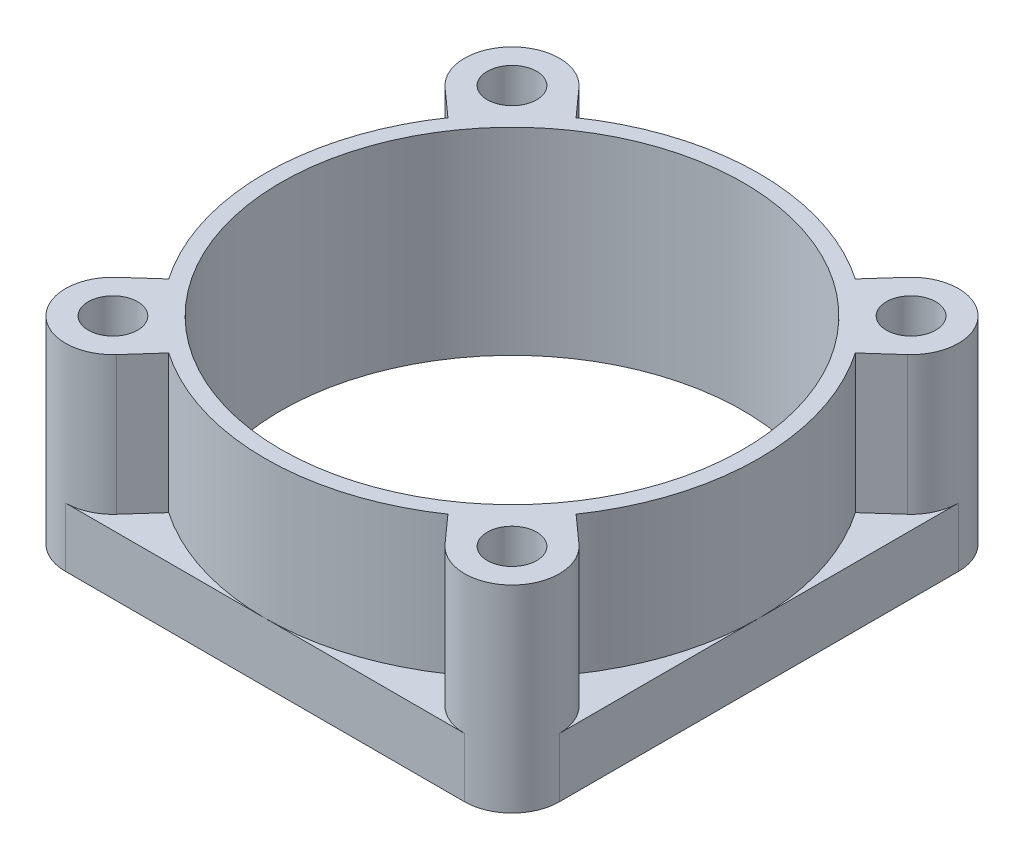
ISO-10303-21;
HEADER;
FILE_DESCRIPTION(('STEP AP214'),'2;1');
FILE_NAME('part.step','',(''),(''),'','','');
FILE_SCHEMA(('AUTOMOTIVE_DESIGN { 1 0 10303 214 1 1 1 1 }'));
ENDSEC;
DATA;
#1=APPLICATION_CONTEXT('core data for automotive mechanical design processes');
#2=APPLICATION_PROTOCOL_DEFINITION('international standard','automotive_design',2000,#1);
#3=PRODUCT_CONTEXT('',#1,'mechanical');
#4=PRODUCT('Part','Part','',(#3));
#5=PRODUCT_RELATED_PRODUCT_CATEGORY('part','',(#4));
#6=PRODUCT_DEFINITION_FORMATION('','',#4);
#7=PRODUCT_DEFINITION_CONTEXT('part definition',#1,'design');
#8=PRODUCT_DEFINITION('design','',#6,#7);
#9=PRODUCT_DEFINITION_SHAPE('','',#8);
#10=(LENGTH_UNIT() NAMED_UNIT(*) SI_UNIT(.MILLI.,.METRE.));
#11=(NAMED_UNIT(*) PLANE_ANGLE_UNIT() SI_UNIT($,.RADIAN.));
#12=(NAMED_UNIT(*) SI_UNIT($,.STERADIAN.) SOLID_ANGLE_UNIT());
#13=UNCERTAINTY_MEASURE_WITH_UNIT(LENGTH_MEASURE(1.E-05),#10,'distance_accuracy_value','');
#14=(GEOMETRIC_REPRESENTATION_CONTEXT(3) GLOBAL_UNCERTAINTY_ASSIGNED_CONTEXT((#13)) GLOBAL_UNIT_ASSIGNED_CONTEXT((#10,
#11,#12)) REPRESENTATION_CONTEXT('',''));
#15=CARTESIAN_POINT('',(0.,0.,0.));
#16=DIRECTION('',(0.,0.,1.));
#17=DIRECTION('',(1.,0.,0.));
#18=AXIS2_PLACEMENT_3D('',#15,#16,#17);
#19=CARTESIAN_POINT('',(-10.1,3.,10.1));
#20=DIRECTION('',(0.,-1.,0.));
#21=DIRECTION('',(0.,0.,-1.));
#22=AXIS2_PLACEMENT_3D('',#19,#20,#21);
#23=PLANE('',#22);
#24=CARTESIAN_POINT('',(0.,3.,0.));
#25=DIRECTION('',(0.,1.,0.));
#26=DIRECTION('',(0.,0.,1.));
#27=AXIS2_PLACEMENT_3D('',#24,#25,#26);
#28=CIRCLE('',#27,12.5);
#29=CARTESIAN_POINT('',(-10.3104171563499,3.,-7.06719874222066));
#30=VERTEX_POINT('',#29);
#31=CARTESIAN_POINT('',(-12.5,3.,0.));
#32=VERTEX_POINT('',#31);
#33=EDGE_CURVE('E311',#30,#32,#28,.T.);
#34=ORIENTED_EDGE('',*,*,#33,.F.);
#35=DIRECTION('',(0.745071934024043,0.,0.666984117599267));
#36=VECTOR('',#35,1.);
#37=CARTESIAN_POINT('',(-1.07472021557158,3.,1.20054413354374));
#38=LINE('',#37,#36);
#39=CARTESIAN_POINT('',(-11.7007618822382,3.,-8.3118273583423));
#40=VERTEX_POINT('',#39);
#41=EDGE_CURVE('E308',#40,#30,#38,.T.);
#42=ORIENTED_EDGE('',*,*,#41,.F.);
#43=CARTESIAN_POINT('',(-10.1,3.,-10.1));
#44=DIRECTION('',(0.,1.,0.));
#45=DIRECTION('',(0.,0.,1.));
#46=AXIS2_PLACEMENT_3D('',#43,#44,#45);
#47=CIRCLE('',#46,2.4);
#48=CARTESIAN_POINT('',(-12.5,3.,-10.1));
#49=VERTEX_POINT('',#48);
#50=EDGE_CURVE('E306',#40,#49,#47,.F.);
#51=ORIENTED_EDGE('',*,*,#50,.T.);
#52=DIRECTION('',(0.,0.,1.));
#53=VECTOR('',#52,1.);
#54=CARTESIAN_POINT('',(-12.5,3.,10.1));
#55=LINE('',#54,#53);
#56=EDGE_CURVE('E369',#49,#32,#55,.T.);
#57=ORIENTED_EDGE('',*,*,#56,.T.);
#58=EDGE_LOOP('',(#34,#42,#51,#57));
#59=FACE_BOUND('',#58,.T.);
#60=ADVANCED_FACE('F41',(#59),#23,.F.);
#61=CARTESIAN_POINT('',(-12.5000000000001,3.,10.1));
#62=VERTEX_POINT('',#61);
#63=EDGE_CURVE('E368',#32,#62,#55,.T.);
#64=ORIENTED_EDGE('',*,*,#63,.T.);
#65=CARTESIAN_POINT('',(-10.1000000000001,3.,10.0999999999999));
#66=DIRECTION('',(0.,1.,0.));
#67=DIRECTION('',(0.,0.,1.));
#68=AXIS2_PLACEMENT_3D('',#65,#66,#67);
#69=CIRCLE('',#68,2.4);
#70=CARTESIAN_POINT('',(-11.7007618822383,3.,8.31182735834218));
#71=VERTEX_POINT('',#70);
#72=EDGE_CURVE('E11',#62,#71,#69,.F.);
#73=ORIENTED_EDGE('',*,*,#72,.T.);
#74=DIRECTION('',(0.74507193402405,0.,-0.666984117599258));
#75=VECTOR('',#74,1.);
#76=CARTESIAN_POINT('',(-1.07472021557156,3.,-1.20054413354375));
#77=LINE('',#76,#75);
#78=CARTESIAN_POINT('',(-10.31041715635,3.,7.06719874222056));
#79=VERTEX_POINT('',#78);
#80=EDGE_CURVE('E313',#71,#79,#77,.T.);
#81=ORIENTED_EDGE('',*,*,#80,.T.);
#82=EDGE_CURVE('E50',#32,#79,#28,.T.);
#83=ORIENTED_EDGE('',*,*,#82,.F.);
#84=EDGE_LOOP('',(#64,#73,#81,#83));
#85=FACE_BOUND('',#84,.T.);
#86=ADVANCED_FACE('F439',(#85),#23,.F.);
#87=CARTESIAN_POINT('',(0.,3.,0.));
#88=DIRECTION('',(0.,1.,0.));
#89=DIRECTION('',(0.,0.,1.));
#90=AXIS2_PLACEMENT_3D('',#87,#88,#89);
#91=CIRCLE('',#90,12.5);
#92=CARTESIAN_POINT('',(7.0671987422207,3.,-10.3104171563499));
#93=VERTEX_POINT('',#92);
#94=CARTESIAN_POINT('',(0.,3.,-12.5));
#95=VERTEX_POINT('',#94);
#96=EDGE_CURVE('E300',#93,#95,#91,.T.);
#97=ORIENTED_EDGE('',*,*,#96,.F.);
#98=DIRECTION('',(-0.666984117599269,0.,0.74507193402404));
#99=VECTOR('',#98,1.);
#100=CARTESIAN_POINT('',(-1.20054413354375,3.,-1.07472021557159));
#101=LINE('',#100,#99);
#102=CARTESIAN_POINT('',(8.31182735834234,3.,-11.7007618822382));
#103=VERTEX_POINT('',#102);
#104=EDGE_CURVE('E297',#103,#93,#101,.T.);
#105=ORIENTED_EDGE('',*,*,#104,.F.);
#106=CARTESIAN_POINT('',(10.1,3.,-10.1));
#107=DIRECTION('',(0.,1.,0.));
#108=DIRECTION('',(0.,0.,1.));
#109=AXIS2_PLACEMENT_3D('',#106,#107,#108);
#110=CIRCLE('',#109,2.4);
#111=CARTESIAN_POINT('',(10.1,3.,-12.5));
#112=VERTEX_POINT('',#111);
#113=EDGE_CURVE('E295',#103,#112,#110,.F.);
#114=ORIENTED_EDGE('',*,*,#113,.T.);
#115=DIRECTION('',(-1.,0.,0.));
#116=VECTOR('',#115,1.);
#117=CARTESIAN_POINT('',(-10.1,3.,-12.5));
#118=LINE('',#117,#116);
#119=EDGE_CURVE('E365',#112,#95,#118,.T.);
#120=ORIENTED_EDGE('',*,*,#119,.T.);
#121=EDGE_LOOP('',(#97,#105,#114,#120));
#122=FACE_BOUND('',#121,.T.);
#123=ADVANCED_FACE('F481',(#122),#23,.F.);
#124=CARTESIAN_POINT('',(-10.1,3.,-12.5));
#125=VERTEX_POINT('',#124);
#126=EDGE_CURVE('E364',#95,#125,#118,.T.);
#127=ORIENTED_EDGE('',*,*,#126,.T.);
#128=CARTESIAN_POINT('',(-8.3118273583423,3.,-11.7007618822382));
#129=VERTEX_POINT('',#128);
#130=EDGE_CURVE('E309',#125,#129,#47,.F.);
#131=ORIENTED_EDGE('',*,*,#130,.T.);
#132=DIRECTION('',(0.666984117599266,0.,0.745071934024043));
#133=VECTOR('',#132,1.);
#134=CARTESIAN_POINT('',(1.20054413354374,3.,-1.07472021557157));
#135=LINE('',#134,#133);
#136=CARTESIAN_POINT('',(-7.06719874222066,3.,-10.3104171563499));
#137=VERTEX_POINT('',#136);
#138=EDGE_CURVE('E302',#129,#137,#135,.T.);
#139=ORIENTED_EDGE('',*,*,#138,.T.);
#140=EDGE_CURVE('E303',#95,#137,#91,.T.);
#141=ORIENTED_EDGE('',*,*,#140,.F.);
#142=EDGE_LOOP('',(#127,#131,#139,#141));
#143=FACE_BOUND('',#142,.T.);
#144=ADVANCED_FACE('F498',(#143),#23,.F.);
#145=CARTESIAN_POINT('',(0.,3.,0.));
#146=DIRECTION('',(0.,1.,0.));
#147=DIRECTION('',(0.,0.,1.));
#148=AXIS2_PLACEMENT_3D('',#145,#146,#147);
#149=CIRCLE('',#148,12.5);
#150=CARTESIAN_POINT('',(10.3104171563499,3.,7.06719874222074));
#151=VERTEX_POINT('',#150);
#152=CARTESIAN_POINT('',(12.5,3.,0.));
#153=VERTEX_POINT('',#152);
#154=EDGE_CURVE('E289',#151,#153,#149,.T.);
#155=ORIENTED_EDGE('',*,*,#154,.F.);
#156=DIRECTION('',(-0.745071934024038,0.,-0.666984117599272));
#157=VECTOR('',#156,1.);
#158=CARTESIAN_POINT('',(1.07472021557158,3.,-1.20054413354374));
#159=LINE('',#158,#157);
#160=CARTESIAN_POINT('',(11.7007618822382,3.,8.31182735834238));
#161=VERTEX_POINT('',#160);
#162=EDGE_CURVE('E286',#161,#151,#159,.T.);
#163=ORIENTED_EDGE('',*,*,#162,.F.);
#164=CARTESIAN_POINT('',(10.0999999999999,3.,10.1000000000001));
#165=DIRECTION('',(0.,1.,0.));
#166=DIRECTION('',(0.,0.,1.));
#167=AXIS2_PLACEMENT_3D('',#164,#165,#166);
#168=CIRCLE('',#167,2.4);
#169=CARTESIAN_POINT('',(12.4999999999999,3.,10.1));
#170=VERTEX_POINT('',#169);
#171=EDGE_CURVE('E284',#161,#170,#168,.F.);
#172=ORIENTED_EDGE('',*,*,#171,.T.);
#173=DIRECTION('',(0.,0.,-1.));
#174=VECTOR('',#173,1.);
#175=CARTESIAN_POINT('',(12.5,3.,10.1));
#176=LINE('',#175,#174);
#177=EDGE_CURVE('E361',#170,#153,#176,.T.);
#178=ORIENTED_EDGE('',*,*,#177,.T.);
#179=EDGE_LOOP('',(#155,#163,#172,#178));
#180=FACE_BOUND('',#179,.T.);
#181=ADVANCED_FACE('F494',(#180),#23,.F.);
#182=CARTESIAN_POINT('',(12.5,3.,-10.1));
#183=VERTEX_POINT('',#182);
#184=EDGE_CURVE('E359',#153,#183,#176,.T.);
#185=ORIENTED_EDGE('',*,*,#184,.T.);
#186=CARTESIAN_POINT('',(11.7007618822383,3.,-8.31182735834226));
#187=VERTEX_POINT('',#186);
#188=EDGE_CURVE('E298',#183,#187,#110,.F.);
#189=ORIENTED_EDGE('',*,*,#188,.T.);
#190=DIRECTION('',(-0.745071934024046,0.,0.666984117599263));
#191=VECTOR('',#190,1.);
#192=CARTESIAN_POINT('',(1.07472021557156,3.,1.20054413354373));
#193=LINE('',#192,#191);
#194=CARTESIAN_POINT('',(10.3104171563499,3.,-7.06719874222063));
#195=VERTEX_POINT('',#194);
#196=EDGE_CURVE('E291',#187,#195,#193,.T.);
#197=ORIENTED_EDGE('',*,*,#196,.T.);
#198=EDGE_CURVE('E292',#153,#195,#149,.T.);
#199=ORIENTED_EDGE('',*,*,#198,.F.);
#200=EDGE_LOOP('',(#185,#189,#197,#199));
#201=FACE_BOUND('',#200,.T.);
#202=ADVANCED_FACE('F490',(#201),#23,.F.);
#203=CARTESIAN_POINT('',(0.,3.,0.));
#204=DIRECTION('',(0.,1.,0.));
#205=DIRECTION('',(0.,0.,1.));
#206=AXIS2_PLACEMENT_3D('',#203,#204,#205);
#207=CIRCLE('',#206,12.5);
#208=CARTESIAN_POINT('',(0.,3.,12.5));
#209=VERTEX_POINT('',#208);
#210=CARTESIAN_POINT('',(7.06719874222059,3.,10.31041715635));
#211=VERTEX_POINT('',#210);
#212=EDGE_CURVE('E236',#209,#211,#207,.T.);
#213=ORIENTED_EDGE('',*,*,#212,.F.);
#214=DIRECTION('',(1.,0.,0.));
#215=VECTOR('',#214,1.);
#216=CARTESIAN_POINT('',(-10.1,3.,12.5));
#217=LINE('',#216,#215);
#218=CARTESIAN_POINT('',(10.1,3.,12.5000000000001));
#219=VERTEX_POINT('',#218);
#220=EDGE_CURVE('E360',#209,#219,#217,.T.);
#221=ORIENTED_EDGE('',*,*,#220,.T.);
#222=CARTESIAN_POINT('',(8.31182735834222,3.,11.7007618822383));
#223=VERTEX_POINT('',#222);
#224=EDGE_CURVE('E287',#219,#223,#168,.F.);
#225=ORIENTED_EDGE('',*,*,#224,.T.);
#226=DIRECTION('',(-0.666984117599261,0.,-0.745071934024048));
#227=VECTOR('',#226,1.);
#228=CARTESIAN_POINT('',(-1.20054413354374,3.,1.07472021557156));
#229=LINE('',#228,#227);
#230=EDGE_CURVE('E281',#223,#211,#229,.T.);
#231=ORIENTED_EDGE('',*,*,#230,.T.);
#232=EDGE_LOOP('',(#213,#221,#225,#231));
#233=FACE_BOUND('',#232,.T.);
#234=ADVANCED_FACE('F466',(#233),#23,.F.);
#235=DIRECTION('',(0.666984117599391,0.,-0.745071934023931));
#236=VECTOR('',#235,1.);
#237=CARTESIAN_POINT('',(1.20054413354523,3.,1.07472021557327));
#238=LINE('',#237,#236);
#239=CARTESIAN_POINT('',(-8.31182735834242,3.,11.7007618822382));
#240=VERTEX_POINT('',#239);
#241=CARTESIAN_POINT('',(-7.06719874222054,3.,10.31041715635));
#242=VERTEX_POINT('',#241);
#243=EDGE_CURVE('E316',#240,#242,#238,.T.);
#244=ORIENTED_EDGE('',*,*,#243,.F.);
#245=CARTESIAN_POINT('',(-10.1,3.,12.4999999999999));
#246=VERTEX_POINT('',#245);
#247=EDGE_CURVE('E52',#240,#246,#69,.F.);
#248=ORIENTED_EDGE('',*,*,#247,.T.);
#249=EDGE_CURVE('E356',#246,#209,#217,.T.);
#250=ORIENTED_EDGE('',*,*,#249,.T.);
#251=EDGE_CURVE('E279',#242,#209,#207,.T.);
#252=ORIENTED_EDGE('',*,*,#251,.F.);
#253=EDGE_LOOP('',(#244,#248,#250,#252));
#254=FACE_BOUND('',#253,.T.);
#255=ADVANCED_FACE('F462',(#254),#23,.F.);
#256=CARTESIAN_POINT('',(-10.1,0.,10.1));
#257=DIRECTION('',(0.,-1.,0.));
#258=DIRECTION('',(0.,0.,-1.));
#259=AXIS2_PLACEMENT_3D('',#256,#257,#258);
#260=PLANE('',#259);
#261=CARTESIAN_POINT('',(10.1,0.,-10.1));
#262=DIRECTION('',(0.,1.,0.));
#263=DIRECTION('',(0.,0.,1.));
#264=AXIS2_PLACEMENT_3D('',#261,#262,#263);
#265=CIRCLE('',#264,1.25);
#266=CARTESIAN_POINT('',(10.1,0.,-8.84999999999997));
#267=VERTEX_POINT('',#266);
#268=EDGE_CURVE('E594',#267,#267,#265,.T.);
#269=ORIENTED_EDGE('',*,*,#268,.T.);
#270=EDGE_LOOP('',(#269));
#271=FACE_BOUND('',#270,.T.);
#272=CARTESIAN_POINT('',(-10.1,0.,-10.1));
#273=DIRECTION('',(0.,1.,0.));
#274=DIRECTION('',(0.,0.,1.));
#275=AXIS2_PLACEMENT_3D('',#272,#273,#274);
#276=CIRCLE('',#275,1.25);
#277=CARTESIAN_POINT('',(-10.1,0.,-8.85));
#278=VERTEX_POINT('',#277);
#279=EDGE_CURVE('E597',#278,#278,#276,.T.);
#280=ORIENTED_EDGE('',*,*,#279,.T.);
#281=EDGE_LOOP('',(#280));
#282=FACE_BOUND('',#281,.T.);
#283=CARTESIAN_POINT('',(-10.1000000000001,0.,10.0999999999999));
#284=DIRECTION('',(0.,1.,0.));
#285=DIRECTION('',(0.,0.,1.));
#286=AXIS2_PLACEMENT_3D('',#283,#284,#285);
#287=CIRCLE('',#286,1.25);
#288=CARTESIAN_POINT('',(-10.1000000000001,0.,11.3499999999999));
#289=VERTEX_POINT('',#288);
#290=EDGE_CURVE('E593',#289,#289,#287,.T.);
#291=ORIENTED_EDGE('',*,*,#290,.T.);
#292=EDGE_LOOP('',(#291));
#293=FACE_BOUND('',#292,.T.);
#294=CARTESIAN_POINT('',(10.0999999999999,0.,10.1000000000001));
#295=DIRECTION('',(0.,1.,0.));
#296=DIRECTION('',(0.,0.,1.));
#297=AXIS2_PLACEMENT_3D('',#294,#295,#296);
#298=CIRCLE('',#297,1.25);
#299=CARTESIAN_POINT('',(10.0999999999999,0.,11.3500000000001));
#300=VERTEX_POINT('',#299);
#301=EDGE_CURVE('E282',#300,#300,#298,.T.);
#302=ORIENTED_EDGE('',*,*,#301,.T.);
#303=EDGE_LOOP('',(#302));
#304=FACE_BOUND('',#303,.T.);
#305=CARTESIAN_POINT('',(-10.1,0.,10.1));
#306=DIRECTION('',(0.,1.,0.));
#307=DIRECTION('',(0.,0.,-1.));
#308=AXIS2_PLACEMENT_3D('',#305,#306,#307);
#309=CIRCLE('',#308,2.4);
#310=CARTESIAN_POINT('',(-12.5,0.,10.1));
#311=VERTEX_POINT('',#310);
#312=CARTESIAN_POINT('',(-10.1,0.,12.5));
#313=VERTEX_POINT('',#312);
#314=EDGE_CURVE('E355',#311,#313,#309,.T.);
#315=ORIENTED_EDGE('',*,*,#314,.F.);
#316=DIRECTION('',(0.,0.,1.));
#317=VECTOR('',#316,1.);
#318=CARTESIAN_POINT('',(-12.5,0.,10.1));
#319=LINE('',#318,#317);
#320=CARTESIAN_POINT('',(-12.5,0.,-10.1));
#321=VERTEX_POINT('',#320);
#322=EDGE_CURVE('E67',#321,#311,#319,.T.);
#323=ORIENTED_EDGE('',*,*,#322,.F.);
#324=CARTESIAN_POINT('',(-10.1,0.,-10.1));
#325=DIRECTION('',(0.,1.,0.));
#326=DIRECTION('',(0.,0.,-1.));
#327=AXIS2_PLACEMENT_3D('',#324,#325,#326);
#328=CIRCLE('',#327,2.4);
#329=CARTESIAN_POINT('',(-10.1,0.,-12.5));
#330=VERTEX_POINT('',#329);
#331=EDGE_CURVE('E385',#330,#321,#328,.T.);
#332=ORIENTED_EDGE('',*,*,#331,.F.);
#333=DIRECTION('',(-1.,0.,0.));
#334=VECTOR('',#333,1.);
#335=CARTESIAN_POINT('',(-10.1,0.,-12.5));
#336=LINE('',#335,#334);
#337=CARTESIAN_POINT('',(10.1,0.,-12.5));
#338=VERTEX_POINT('',#337);
#339=EDGE_CURVE('E383',#338,#330,#336,.T.);
#340=ORIENTED_EDGE('',*,*,#339,.F.);
#341=CARTESIAN_POINT('',(10.1,0.,-10.1));
#342=DIRECTION('',(0.,1.,0.));
#343=DIRECTION('',(0.,0.,-1.));
#344=AXIS2_PLACEMENT_3D('',#341,#342,#343);
#345=CIRCLE('',#344,2.4);
#346=CARTESIAN_POINT('',(12.5,0.,-10.1));
#347=VERTEX_POINT('',#346);
#348=EDGE_CURVE('E381',#347,#338,#345,.T.);
#349=ORIENTED_EDGE('',*,*,#348,.F.);
#350=DIRECTION('',(0.,0.,-1.));
#351=VECTOR('',#350,1.);
#352=CARTESIAN_POINT('',(12.5,0.,10.1));
#353=LINE('',#352,#351);
#354=CARTESIAN_POINT('',(12.5,0.,10.1));
#355=VERTEX_POINT('',#354);
#356=EDGE_CURVE('E379',#355,#347,#353,.T.);
#357=ORIENTED_EDGE('',*,*,#356,.F.);
#358=CARTESIAN_POINT('',(10.1,0.,10.1));
#359=DIRECTION('',(0.,1.,0.));
#360=DIRECTION('',(0.,0.,1.));
#361=AXIS2_PLACEMENT_3D('',#358,#359,#360);
#362=CIRCLE('',#361,2.4);
#363=CARTESIAN_POINT('',(10.1,0.,12.5));
#364=VERTEX_POINT('',#363);
#365=EDGE_CURVE('E377',#364,#355,#362,.T.);
#366=ORIENTED_EDGE('',*,*,#365,.F.);
#367=DIRECTION('',(1.,0.,0.));
#368=VECTOR('',#367,1.);
#369=CARTESIAN_POINT('',(-10.1,0.,12.5));
#370=LINE('',#369,#368);
#371=EDGE_CURVE('E375',#313,#364,#370,.T.);
#372=ORIENTED_EDGE('',*,*,#371,.F.);
#373=EDGE_LOOP('',(#315,#323,#332,#340,#349,#357,#366,#372));
#374=FACE_BOUND('',#373,.T.);
#375=CARTESIAN_POINT('',(0.,0.,0.));
#376=DIRECTION('',(0.,1.,0.));
#377=DIRECTION('',(0.,0.,1.));
#378=AXIS2_PLACEMENT_3D('',#375,#376,#377);
#379=CIRCLE('',#378,11.7);
#380=CARTESIAN_POINT('',(0.,0.,11.7));
#381=VERTEX_POINT('',#380);
#382=EDGE_CURVE('E238',#381,#381,#379,.T.);
#383=ORIENTED_EDGE('',*,*,#382,.T.);
#384=EDGE_LOOP('',(#383));
#385=FACE_BOUND('',#384,.T.);
#386=ADVANCED_FACE('F455',(#271,#282,#293,#304,#374,#385),#260,.T.);
#387=CARTESIAN_POINT('',(-10.1,3.,10.1));
#388=DIRECTION('',(0.,-1.,0.));
#389=DIRECTION('',(0.,0.,-1.));
#390=AXIS2_PLACEMENT_3D('',#387,#388,#389);
#391=CYLINDRICAL_SURFACE('',#390,2.4);
#392=ORIENTED_EDGE('',*,*,#314,.T.);
#393=DIRECTION('',(0.,-1.,0.));
#394=VECTOR('',#393,1.);
#395=CARTESIAN_POINT('',(-10.1,3.,12.5));
#396=LINE('',#395,#394);
#397=EDGE_CURVE('E45',#246,#313,#396,.T.);
#398=ORIENTED_EDGE('',*,*,#397,.F.);
#399=ORIENTED_EDGE('',*,*,#247,.F.);
#400=DIRECTION('',(0.,-1.,0.));
#401=VECTOR('',#400,1.);
#402=CARTESIAN_POINT('',(-8.31182735834242,10.,11.7007618822382));
#403=LINE('',#402,#401);
#404=CARTESIAN_POINT('',(-8.31182735834242,10.,11.7007618822382));
#405=VERTEX_POINT('',#404);
#406=EDGE_CURVE('E320',#405,#240,#403,.T.);
#407=ORIENTED_EDGE('',*,*,#406,.F.);
#408=CARTESIAN_POINT('',(-10.1000000000001,10.,10.0999999999999));
#409=DIRECTION('',(0.,1.,0.));
#410=DIRECTION('',(0.,0.,1.));
#411=AXIS2_PLACEMENT_3D('',#408,#409,#410);
#412=CIRCLE('',#411,2.4);
#413=CARTESIAN_POINT('',(-11.7007618822383,10.,8.31182735834218));
#414=VERTEX_POINT('',#413);
#415=EDGE_CURVE('E274',#405,#414,#412,.F.);
#416=ORIENTED_EDGE('',*,*,#415,.T.);
#417=DIRECTION('',(0.,-1.,0.));
#418=VECTOR('',#417,1.);
#419=CARTESIAN_POINT('',(-11.7007618822383,10.,8.31182735834218));
#420=LINE('',#419,#418);
#421=EDGE_CURVE('E322',#414,#71,#420,.T.);
#422=ORIENTED_EDGE('',*,*,#421,.T.);
#423=ORIENTED_EDGE('',*,*,#72,.F.);
#424=DIRECTION('',(0.,-1.,0.));
#425=VECTOR('',#424,1.);
#426=CARTESIAN_POINT('',(-12.5,3.,10.1));
#427=LINE('',#426,#425);
#428=EDGE_CURVE('E372',#62,#311,#427,.T.);
#429=ORIENTED_EDGE('',*,*,#428,.T.);
#430=EDGE_LOOP('',(#392,#398,#399,#407,#416,#422,#423,#429));
#431=FACE_BOUND('',#430,.T.);
#432=ADVANCED_FACE('F43',(#431),#391,.T.);
#433=CARTESIAN_POINT('',(-10.1,3.,12.5));
#434=DIRECTION('',(0.,0.,-1.));
#435=DIRECTION('',(-1.,0.,0.));
#436=AXIS2_PLACEMENT_3D('',#433,#434,#435);
#437=PLANE('',#436);
#438=ORIENTED_EDGE('',*,*,#371,.T.);
#439=DIRECTION('',(0.,-1.,0.));
#440=VECTOR('',#439,1.);
#441=CARTESIAN_POINT('',(10.1,3.,12.5));
#442=LINE('',#441,#440);
#443=EDGE_CURVE('E402',#219,#364,#442,.T.);
#444=ORIENTED_EDGE('',*,*,#443,.F.);
#445=ORIENTED_EDGE('',*,*,#220,.F.);
#446=ORIENTED_EDGE('',*,*,#249,.F.);
#447=ORIENTED_EDGE('',*,*,#397,.T.);
#448=EDGE_LOOP('',(#438,#444,#445,#446,#447));
#449=FACE_BOUND('',#448,.T.);
#450=ADVANCED_FACE('F467',(#449),#437,.F.);
#451=CARTESIAN_POINT('',(10.1,3.,10.1));
#452=DIRECTION('',(0.,-1.,0.));
#453=DIRECTION('',(0.,0.,-1.));
#454=AXIS2_PLACEMENT_3D('',#451,#452,#453);
#455=CYLINDRICAL_SURFACE('',#454,2.4);
#456=ORIENTED_EDGE('',*,*,#365,.T.);
#457=DIRECTION('',(0.,-1.,0.));
#458=VECTOR('',#457,1.);
#459=CARTESIAN_POINT('',(12.5,3.,10.1));
#460=LINE('',#459,#458);
#461=EDGE_CURVE('E400',#170,#355,#460,.T.);
#462=ORIENTED_EDGE('',*,*,#461,.F.);
#463=ORIENTED_EDGE('',*,*,#171,.F.);
#464=DIRECTION('',(0.,-1.,0.));
#465=VECTOR('',#464,1.);
#466=CARTESIAN_POINT('',(11.7007618822382,10.,8.31182735834238));
#467=LINE('',#466,#465);
#468=CARTESIAN_POINT('',(11.7007618822382,10.,8.31182735834238));
#469=VERTEX_POINT('',#468);
#470=EDGE_CURVE('E350',#469,#161,#467,.T.);
#471=ORIENTED_EDGE('',*,*,#470,.F.);
#472=CARTESIAN_POINT('',(10.0999999999999,10.,10.1000000000001));
#473=DIRECTION('',(0.,1.,0.));
#474=DIRECTION('',(0.,0.,1.));
#475=AXIS2_PLACEMENT_3D('',#472,#473,#474);
#476=CIRCLE('',#475,2.4);
#477=CARTESIAN_POINT('',(8.31182735834222,10.,11.7007618822383));
#478=VERTEX_POINT('',#477);
#479=EDGE_CURVE('E242',#469,#478,#476,.F.);
#480=ORIENTED_EDGE('',*,*,#479,.T.);
#481=DIRECTION('',(0.,-1.,0.));
#482=VECTOR('',#481,1.);
#483=CARTESIAN_POINT('',(8.31182735834222,10.,11.7007618822383));
#484=LINE('',#483,#482);
#485=EDGE_CURVE('E239',#478,#223,#484,.T.);
#486=ORIENTED_EDGE('',*,*,#485,.T.);
#487=ORIENTED_EDGE('',*,*,#224,.F.);
#488=ORIENTED_EDGE('',*,*,#443,.T.);
#489=EDGE_LOOP('',(#456,#462,#463,#471,#480,#486,#487,#488));
#490=FACE_BOUND('',#489,.T.);
#491=ADVANCED_FACE('F469',(#490),#455,.T.);
#492=CARTESIAN_POINT('',(12.5,3.,10.1));
#493=DIRECTION('',(-1.,0.,0.));
#494=DIRECTION('',(0.,0.,1.));
#495=AXIS2_PLACEMENT_3D('',#492,#493,#494);
#496=PLANE('',#495);
#497=ORIENTED_EDGE('',*,*,#356,.T.);
#498=DIRECTION('',(0.,-1.,0.));
#499=VECTOR('',#498,1.);
#500=CARTESIAN_POINT('',(12.5,3.,-10.1));
#501=LINE('',#500,#499);
#502=EDGE_CURVE('E397',#183,#347,#501,.T.);
#503=ORIENTED_EDGE('',*,*,#502,.F.);
#504=ORIENTED_EDGE('',*,*,#184,.F.);
#505=ORIENTED_EDGE('',*,*,#177,.F.);
#506=ORIENTED_EDGE('',*,*,#461,.T.);
#507=EDGE_LOOP('',(#497,#503,#504,#505,#506));
#508=FACE_BOUND('',#507,.T.);
#509=ADVANCED_FACE('F474',(#508),#496,.F.);
#510=CARTESIAN_POINT('',(10.1,3.,-10.1));
#511=DIRECTION('',(0.,-1.,0.));
#512=DIRECTION('',(0.,0.,-1.));
#513=AXIS2_PLACEMENT_3D('',#510,#511,#512);
#514=CYLINDRICAL_SURFACE('',#513,2.4);
#515=ORIENTED_EDGE('',*,*,#348,.T.);
#516=DIRECTION('',(0.,-1.,0.));
#517=VECTOR('',#516,1.);
#518=CARTESIAN_POINT('',(10.1,3.,-12.5));
#519=LINE('',#518,#517);
#520=EDGE_CURVE('E394',#112,#338,#519,.T.);
#521=ORIENTED_EDGE('',*,*,#520,.F.);
#522=ORIENTED_EDGE('',*,*,#113,.F.);
#523=DIRECTION('',(0.,-1.,0.));
#524=VECTOR('',#523,1.);
#525=CARTESIAN_POINT('',(8.31182735834234,10.,-11.7007618822382));
#526=LINE('',#525,#524);
#527=CARTESIAN_POINT('',(8.31182735834234,10.,-11.7007618822382));
#528=VERTEX_POINT('',#527);
#529=EDGE_CURVE('E340',#528,#103,#526,.T.);
#530=ORIENTED_EDGE('',*,*,#529,.F.);
#531=CARTESIAN_POINT('',(10.1,10.,-10.1));
#532=DIRECTION('',(0.,1.,0.));
#533=DIRECTION('',(0.,0.,1.));
#534=AXIS2_PLACEMENT_3D('',#531,#532,#533);
#535=CIRCLE('',#534,2.4);
#536=CARTESIAN_POINT('',(11.7007618822383,10.,-8.31182735834226));
#537=VERTEX_POINT('',#536);
#538=EDGE_CURVE('E254',#528,#537,#535,.F.);
#539=ORIENTED_EDGE('',*,*,#538,.T.);
#540=DIRECTION('',(0.,-1.,0.));
#541=VECTOR('',#540,1.);
#542=CARTESIAN_POINT('',(11.7007618822383,10.,-8.31182735834226));
#543=LINE('',#542,#541);
#544=EDGE_CURVE('E342',#537,#187,#543,.T.);
#545=ORIENTED_EDGE('',*,*,#544,.T.);
#546=ORIENTED_EDGE('',*,*,#188,.F.);
#547=ORIENTED_EDGE('',*,*,#502,.T.);
#548=EDGE_LOOP('',(#515,#521,#522,#530,#539,#545,#546,#547));
#549=FACE_BOUND('',#548,.T.);
#550=ADVANCED_FACE('F507',(#549),#514,.T.);
#551=CARTESIAN_POINT('',(-10.1,3.,-12.5));
#552=DIRECTION('',(0.,0.,1.));
#553=DIRECTION('',(1.,0.,0.));
#554=AXIS2_PLACEMENT_3D('',#551,#552,#553);
#555=PLANE('',#554);
#556=ORIENTED_EDGE('',*,*,#339,.T.);
#557=DIRECTION('',(0.,-1.,0.));
#558=VECTOR('',#557,1.);
#559=CARTESIAN_POINT('',(-10.1,3.,-12.5));
#560=LINE('',#559,#558);
#561=EDGE_CURVE('E391',#125,#330,#560,.T.);
#562=ORIENTED_EDGE('',*,*,#561,.F.);
#563=ORIENTED_EDGE('',*,*,#126,.F.);
#564=ORIENTED_EDGE('',*,*,#119,.F.);
#565=ORIENTED_EDGE('',*,*,#520,.T.);
#566=EDGE_LOOP('',(#556,#562,#563,#564,#565));
#567=FACE_BOUND('',#566,.T.);
#568=ADVANCED_FACE('F511',(#567),#555,.F.);
#569=CARTESIAN_POINT('',(-10.1,3.,-10.1));
#570=DIRECTION('',(0.,-1.,0.));
#571=DIRECTION('',(0.,0.,-1.));
#572=AXIS2_PLACEMENT_3D('',#569,#570,#571);
#573=CYLINDRICAL_SURFACE('',#572,2.4);
#574=ORIENTED_EDGE('',*,*,#331,.T.);
#575=DIRECTION('',(0.,-1.,0.));
#576=VECTOR('',#575,1.);
#577=CARTESIAN_POINT('',(-12.5,3.,-10.1));
#578=LINE('',#577,#576);
#579=EDGE_CURVE('E389',#49,#321,#578,.T.);
#580=ORIENTED_EDGE('',*,*,#579,.F.);
#581=ORIENTED_EDGE('',*,*,#50,.F.);
#582=DIRECTION('',(0.,-1.,0.));
#583=VECTOR('',#582,1.);
#584=CARTESIAN_POINT('',(-11.7007618822382,10.,-8.3118273583423));
#585=LINE('',#584,#583);
#586=CARTESIAN_POINT('',(-11.7007618822382,10.,-8.3118273583423));
#587=VERTEX_POINT('',#586);
#588=EDGE_CURVE('E330',#587,#40,#585,.T.);
#589=ORIENTED_EDGE('',*,*,#588,.F.);
#590=CARTESIAN_POINT('',(-10.1,10.,-10.1));
#591=DIRECTION('',(0.,1.,0.));
#592=DIRECTION('',(0.,0.,1.));
#593=AXIS2_PLACEMENT_3D('',#590,#591,#592);
#594=CIRCLE('',#593,2.4);
#595=CARTESIAN_POINT('',(-8.3118273583423,10.,-11.7007618822382));
#596=VERTEX_POINT('',#595);
#597=EDGE_CURVE('E264',#587,#596,#594,.F.);
#598=ORIENTED_EDGE('',*,*,#597,.T.);
#599=DIRECTION('',(0.,-1.,0.));
#600=VECTOR('',#599,1.);
#601=CARTESIAN_POINT('',(-8.3118273583423,10.,-11.7007618822382));
#602=LINE('',#601,#600);
#603=EDGE_CURVE('E332',#596,#129,#602,.T.);
#604=ORIENTED_EDGE('',*,*,#603,.T.);
#605=ORIENTED_EDGE('',*,*,#130,.F.);
#606=ORIENTED_EDGE('',*,*,#561,.T.);
#607=EDGE_LOOP('',(#574,#580,#581,#589,#598,#604,#605,#606));
#608=FACE_BOUND('',#607,.T.);
#609=ADVANCED_FACE('F514',(#608),#573,.T.);
#610=CARTESIAN_POINT('',(-12.5,3.,10.1));
#611=DIRECTION('',(1.,0.,0.));
#612=DIRECTION('',(0.,0.,-1.));
#613=AXIS2_PLACEMENT_3D('',#610,#611,#612);
#614=PLANE('',#613);
#615=ORIENTED_EDGE('',*,*,#322,.T.);
#616=ORIENTED_EDGE('',*,*,#428,.F.);
#617=ORIENTED_EDGE('',*,*,#63,.F.);
#618=ORIENTED_EDGE('',*,*,#56,.F.);
#619=ORIENTED_EDGE('',*,*,#579,.T.);
#620=EDGE_LOOP('',(#615,#616,#617,#618,#619));
#621=FACE_BOUND('',#620,.T.);
#622=ADVANCED_FACE('F451',(#621),#614,.F.);
#623=CARTESIAN_POINT('',(0.,3.,0.));
#624=DIRECTION('',(0.,-1.,0.));
#625=DIRECTION('',(0.,0.,-1.));
#626=AXIS2_PLACEMENT_3D('',#623,#624,#625);
#627=CYLINDRICAL_SURFACE('',#626,11.7);
#628=ORIENTED_EDGE('',*,*,#382,.F.);
#629=EDGE_LOOP('',(#628));
#630=FACE_BOUND('',#629,.T.);
#631=CARTESIAN_POINT('',(0.,10.,0.));
#632=DIRECTION('',(0.,1.,0.));
#633=DIRECTION('',(0.,0.,1.));
#634=AXIS2_PLACEMENT_3D('',#631,#632,#633);
#635=CIRCLE('',#634,11.7);
#636=CARTESIAN_POINT('',(0.,10.,11.7));
#637=VERTEX_POINT('',#636);
#638=EDGE_CURVE('E232',#637,#637,#635,.F.);
#639=ORIENTED_EDGE('',*,*,#638,.F.);
#640=EDGE_LOOP('',(#639));
#641=FACE_BOUND('',#640,.T.);
#642=ADVANCED_FACE('F552',(#630,#641),#627,.F.);
#643=CARTESIAN_POINT('',(0.,10.,0.));
#644=DIRECTION('',(0.,-1.,0.));
#645=DIRECTION('',(0.,0.,-1.));
#646=AXIS2_PLACEMENT_3D('',#643,#644,#645);
#647=CYLINDRICAL_SURFACE('',#646,12.5);
#648=ORIENTED_EDGE('',*,*,#251,.T.);
#649=ORIENTED_EDGE('',*,*,#212,.T.);
#650=DIRECTION('',(0.,-1.,0.));
#651=VECTOR('',#650,1.);
#652=CARTESIAN_POINT('',(7.06719874222059,10.,10.31041715635));
#653=LINE('',#652,#651);
#654=CARTESIAN_POINT('',(7.06719874222059,10.,10.31041715635));
#655=VERTEX_POINT('',#654);
#656=EDGE_CURVE('E59',#655,#211,#653,.T.);
#657=ORIENTED_EDGE('',*,*,#656,.F.);
#658=CARTESIAN_POINT('',(0.,10.,0.));
#659=DIRECTION('',(0.,1.,0.));
#660=DIRECTION('',(0.,0.,1.));
#661=AXIS2_PLACEMENT_3D('',#658,#659,#660);
#662=CIRCLE('',#661,12.5);
#663=CARTESIAN_POINT('',(-7.06719874222054,10.,10.31041715635));
#664=VERTEX_POINT('',#663);
#665=EDGE_CURVE('E221',#664,#655,#662,.T.);
#666=ORIENTED_EDGE('',*,*,#665,.F.);
#667=DIRECTION('',(0.,-1.,0.));
#668=VECTOR('',#667,1.);
#669=CARTESIAN_POINT('',(-7.06719874222054,10.,10.31041715635));
#670=LINE('',#669,#668);
#671=EDGE_CURVE('E278',#664,#242,#670,.T.);
#672=ORIENTED_EDGE('',*,*,#671,.T.);
#673=EDGE_LOOP('',(#648,#649,#657,#666,#672));
#674=FACE_BOUND('',#673,.T.);
#675=ADVANCED_FACE('F234',(#674),#647,.T.);
#676=CARTESIAN_POINT('',(-1.20054413354374,10.,1.07472021557156));
#677=DIRECTION('',(-0.745071934024048,0.,0.666984117599261));
#678=DIRECTION('',(0.666984117599261,0.,0.745071934024048));
#679=AXIS2_PLACEMENT_3D('',#676,#677,#678);
#680=PLANE('',#679);
#681=ORIENTED_EDGE('',*,*,#230,.F.);
#682=ORIENTED_EDGE('',*,*,#485,.F.);
#683=DIRECTION('',(-0.666984117599261,0.,-0.745071934024048));
#684=VECTOR('',#683,1.);
#685=CARTESIAN_POINT('',(-1.20054413354374,10.,1.07472021557156));
#686=LINE('',#685,#684);
#687=EDGE_CURVE('E224',#478,#655,#686,.T.);
#688=ORIENTED_EDGE('',*,*,#687,.T.);
#689=ORIENTED_EDGE('',*,*,#656,.T.);
#690=EDGE_LOOP('',(#681,#682,#688,#689));
#691=FACE_BOUND('',#690,.T.);
#692=ADVANCED_FACE('F241',(#691),#680,.T.);
#693=CARTESIAN_POINT('',(1.07472021557158,10.,-1.20054413354374));
#694=DIRECTION('',(-0.666984117599272,0.,0.745071934024038));
#695=DIRECTION('',(0.745071934024038,0.,0.666984117599272));
#696=AXIS2_PLACEMENT_3D('',#693,#694,#695);
#697=PLANE('',#696);
#698=ORIENTED_EDGE('',*,*,#162,.T.);
#699=DIRECTION('',(0.,-1.,0.));
#700=VECTOR('',#699,1.);
#701=CARTESIAN_POINT('',(10.3104171563499,10.,7.06719874222074));
#702=LINE('',#701,#700);
#703=CARTESIAN_POINT('',(10.3104171563499,10.,7.06719874222074));
#704=VERTEX_POINT('',#703);
#705=EDGE_CURVE('E347',#704,#151,#702,.T.);
#706=ORIENTED_EDGE('',*,*,#705,.F.);
#707=DIRECTION('',(-0.745071934024038,0.,-0.666984117599272));
#708=VECTOR('',#707,1.);
#709=CARTESIAN_POINT('',(1.07472021557158,10.,-1.20054413354374));
#710=LINE('',#709,#708);
#711=EDGE_CURVE('E244',#469,#704,#710,.T.);
#712=ORIENTED_EDGE('',*,*,#711,.F.);
#713=ORIENTED_EDGE('',*,*,#470,.T.);
#714=EDGE_LOOP('',(#698,#706,#712,#713));
#715=FACE_BOUND('',#714,.T.);
#716=ADVANCED_FACE('F539',(#715),#697,.F.);
#717=CARTESIAN_POINT('',(0.,10.,0.));
#718=DIRECTION('',(0.,-1.,0.));
#719=DIRECTION('',(0.,0.,-1.));
#720=AXIS2_PLACEMENT_3D('',#717,#718,#719);
#721=CYLINDRICAL_SURFACE('',#720,12.5);
#722=ORIENTED_EDGE('',*,*,#154,.T.);
#723=ORIENTED_EDGE('',*,*,#198,.T.);
#724=DIRECTION('',(0.,-1.,0.));
#725=VECTOR('',#724,1.);
#726=CARTESIAN_POINT('',(10.3104171563499,10.,-7.06719874222063));
#727=LINE('',#726,#725);
#728=CARTESIAN_POINT('',(10.3104171563499,10.,-7.06719874222063));
#729=VERTEX_POINT('',#728);
#730=EDGE_CURVE('E344',#729,#195,#727,.T.);
#731=ORIENTED_EDGE('',*,*,#730,.F.);
#732=CARTESIAN_POINT('',(0.,10.,0.));
#733=DIRECTION('',(0.,1.,0.));
#734=DIRECTION('',(0.,0.,1.));
#735=AXIS2_PLACEMENT_3D('',#732,#733,#734);
#736=CIRCLE('',#735,12.5);
#737=EDGE_CURVE('E249',#704,#729,#736,.T.);
#738=ORIENTED_EDGE('',*,*,#737,.F.);
#739=ORIENTED_EDGE('',*,*,#705,.T.);
#740=EDGE_LOOP('',(#722,#723,#731,#738,#739));
#741=FACE_BOUND('',#740,.T.);
#742=ADVANCED_FACE('F531',(#741),#721,.T.);
#743=CARTESIAN_POINT('',(1.07472021557156,10.,1.20054413354373));
#744=DIRECTION('',(0.666984117599263,0.,0.745071934024046));
#745=DIRECTION('',(0.745071934024046,0.,-0.666984117599263));
#746=AXIS2_PLACEMENT_3D('',#743,#744,#745);
#747=PLANE('',#746);
#748=ORIENTED_EDGE('',*,*,#196,.F.);
#749=ORIENTED_EDGE('',*,*,#544,.F.);
#750=DIRECTION('',(-0.745071934024046,0.,0.666984117599263));
#751=VECTOR('',#750,1.);
#752=CARTESIAN_POINT('',(1.07472021557156,10.,1.20054413354373));
#753=LINE('',#752,#751);
#754=EDGE_CURVE('E251',#537,#729,#753,.T.);
#755=ORIENTED_EDGE('',*,*,#754,.T.);
#756=ORIENTED_EDGE('',*,*,#730,.T.);
#757=EDGE_LOOP('',(#748,#749,#755,#756));
#758=FACE_BOUND('',#757,.T.);
#759=ADVANCED_FACE('F530',(#758),#747,.T.);
#760=CARTESIAN_POINT('',(-1.20054413354375,10.,-1.07472021557159));
#761=DIRECTION('',(0.74507193402404,0.,0.666984117599269));
#762=DIRECTION('',(0.666984117599269,0.,-0.74507193402404));
#763=AXIS2_PLACEMENT_3D('',#760,#761,#762);
#764=PLANE('',#763);
#765=ORIENTED_EDGE('',*,*,#104,.T.);
#766=DIRECTION('',(0.,-1.,0.));
#767=VECTOR('',#766,1.);
#768=CARTESIAN_POINT('',(7.0671987422207,10.,-10.3104171563499));
#769=LINE('',#768,#767);
#770=CARTESIAN_POINT('',(7.0671987422207,10.,-10.3104171563499));
#771=VERTEX_POINT('',#770);
#772=EDGE_CURVE('E337',#771,#93,#769,.T.);
#773=ORIENTED_EDGE('',*,*,#772,.F.);
#774=DIRECTION('',(-0.666984117599269,0.,0.74507193402404));
#775=VECTOR('',#774,1.);
#776=CARTESIAN_POINT('',(-1.20054413354375,10.,-1.07472021557159));
#777=LINE('',#776,#775);
#778=EDGE_CURVE('E257',#528,#771,#777,.T.);
#779=ORIENTED_EDGE('',*,*,#778,.F.);
#780=ORIENTED_EDGE('',*,*,#529,.T.);
#781=EDGE_LOOP('',(#765,#773,#779,#780));
#782=FACE_BOUND('',#781,.T.);
#783=ADVANCED_FACE('F524',(#782),#764,.F.);
#784=CARTESIAN_POINT('',(0.,10.,0.));
#785=DIRECTION('',(0.,-1.,0.));
#786=DIRECTION('',(0.,0.,-1.));
#787=AXIS2_PLACEMENT_3D('',#784,#785,#786);
#788=CYLINDRICAL_SURFACE('',#787,12.5);
#789=ORIENTED_EDGE('',*,*,#96,.T.);
#790=ORIENTED_EDGE('',*,*,#140,.T.);
#791=DIRECTION('',(0.,-1.,0.));
#792=VECTOR('',#791,1.);
#793=CARTESIAN_POINT('',(-7.06719874222066,10.,-10.3104171563499));
#794=LINE('',#793,#792);
#795=CARTESIAN_POINT('',(-7.06719874222066,10.,-10.3104171563499));
#796=VERTEX_POINT('',#795);
#797=EDGE_CURVE('E334',#796,#137,#794,.T.);
#798=ORIENTED_EDGE('',*,*,#797,.F.);
#799=CARTESIAN_POINT('',(0.,10.,0.));
#800=DIRECTION('',(0.,1.,0.));
#801=DIRECTION('',(0.,0.,1.));
#802=AXIS2_PLACEMENT_3D('',#799,#800,#801);
#803=CIRCLE('',#802,12.5);
#804=EDGE_CURVE('E259',#771,#796,#803,.T.);
#805=ORIENTED_EDGE('',*,*,#804,.F.);
#806=ORIENTED_EDGE('',*,*,#772,.T.);
#807=EDGE_LOOP('',(#789,#790,#798,#805,#806));
#808=FACE_BOUND('',#807,.T.);
#809=ADVANCED_FACE('F637',(#808),#788,.T.);
#810=CARTESIAN_POINT('',(1.20054413354374,10.,-1.07472021557157));
#811=DIRECTION('',(0.745071934024044,0.,-0.666984117599266));
#812=DIRECTION('',(-0.666984117599266,0.,-0.745071934024044));
#813=AXIS2_PLACEMENT_3D('',#810,#811,#812);
#814=PLANE('',#813);
#815=ORIENTED_EDGE('',*,*,#138,.F.);
#816=ORIENTED_EDGE('',*,*,#603,.F.);
#817=DIRECTION('',(0.666984117599266,0.,0.745071934024043));
#818=VECTOR('',#817,1.);
#819=CARTESIAN_POINT('',(1.20054413354374,10.,-1.07472021557157));
#820=LINE('',#819,#818);
#821=EDGE_CURVE('E261',#596,#796,#820,.T.);
#822=ORIENTED_EDGE('',*,*,#821,.T.);
#823=ORIENTED_EDGE('',*,*,#797,.T.);
#824=EDGE_LOOP('',(#815,#816,#822,#823));
#825=FACE_BOUND('',#824,.T.);
#826=ADVANCED_FACE('F634',(#825),#814,.T.);
#827=CARTESIAN_POINT('',(-1.07472021557158,10.,1.20054413354374));
#828=DIRECTION('',(0.666984117599267,0.,-0.745071934024043));
#829=DIRECTION('',(-0.745071934024043,0.,-0.666984117599267));
#830=AXIS2_PLACEMENT_3D('',#827,#828,#829);
#831=PLANE('',#830);
#832=ORIENTED_EDGE('',*,*,#41,.T.);
#833=DIRECTION('',(0.,-1.,0.));
#834=VECTOR('',#833,1.);
#835=CARTESIAN_POINT('',(-10.3104171563499,10.,-7.06719874222066));
#836=LINE('',#835,#834);
#837=CARTESIAN_POINT('',(-10.3104171563499,10.,-7.06719874222066));
#838=VERTEX_POINT('',#837);
#839=EDGE_CURVE('E327',#838,#30,#836,.T.);
#840=ORIENTED_EDGE('',*,*,#839,.F.);
#841=DIRECTION('',(0.745071934024043,0.,0.666984117599267));
#842=VECTOR('',#841,1.);
#843=CARTESIAN_POINT('',(-1.07472021557158,10.,1.20054413354374));
#844=LINE('',#843,#842);
#845=EDGE_CURVE('E267',#587,#838,#844,.T.);
#846=ORIENTED_EDGE('',*,*,#845,.F.);
#847=ORIENTED_EDGE('',*,*,#588,.T.);
#848=EDGE_LOOP('',(#832,#840,#846,#847));
#849=FACE_BOUND('',#848,.T.);
#850=ADVANCED_FACE('F631',(#849),#831,.F.);
#851=CARTESIAN_POINT('',(0.,10.,0.));
#852=DIRECTION('',(0.,-1.,0.));
#853=DIRECTION('',(0.,0.,-1.));
#854=AXIS2_PLACEMENT_3D('',#851,#852,#853);
#855=CYLINDRICAL_SURFACE('',#854,12.5);
#856=ORIENTED_EDGE('',*,*,#33,.T.);
#857=ORIENTED_EDGE('',*,*,#82,.T.);
#858=DIRECTION('',(0.,-1.,0.));
#859=VECTOR('',#858,1.);
#860=CARTESIAN_POINT('',(-10.31041715635,10.,7.06719874222056));
#861=LINE('',#860,#859);
#862=CARTESIAN_POINT('',(-10.31041715635,10.,7.06719874222056));
#863=VERTEX_POINT('',#862);
#864=EDGE_CURVE('E324',#863,#79,#861,.T.);
#865=ORIENTED_EDGE('',*,*,#864,.F.);
#866=CARTESIAN_POINT('',(0.,10.,0.));
#867=DIRECTION('',(0.,1.,0.));
#868=DIRECTION('',(0.,0.,1.));
#869=AXIS2_PLACEMENT_3D('',#866,#867,#868);
#870=CIRCLE('',#869,12.5);
#871=EDGE_CURVE('E269',#838,#863,#870,.T.);
#872=ORIENTED_EDGE('',*,*,#871,.F.);
#873=ORIENTED_EDGE('',*,*,#839,.T.);
#874=EDGE_LOOP('',(#856,#857,#865,#872,#873));
#875=FACE_BOUND('',#874,.T.);
#876=ADVANCED_FACE('F429',(#875),#855,.T.);
#877=CARTESIAN_POINT('',(-1.07472021557156,10.,-1.20054413354375));
#878=DIRECTION('',(-0.666984117599259,0.,-0.74507193402405));
#879=DIRECTION('',(-0.74507193402405,0.,0.666984117599259));
#880=AXIS2_PLACEMENT_3D('',#877,#878,#879);
#881=PLANE('',#880);
#882=ORIENTED_EDGE('',*,*,#80,.F.);
#883=ORIENTED_EDGE('',*,*,#421,.F.);
#884=DIRECTION('',(0.74507193402405,0.,-0.666984117599258));
#885=VECTOR('',#884,1.);
#886=CARTESIAN_POINT('',(-1.07472021557156,10.,-1.20054413354375));
#887=LINE('',#886,#885);
#888=EDGE_CURVE('E271',#414,#863,#887,.T.);
#889=ORIENTED_EDGE('',*,*,#888,.T.);
#890=ORIENTED_EDGE('',*,*,#864,.T.);
#891=EDGE_LOOP('',(#882,#883,#889,#890));
#892=FACE_BOUND('',#891,.T.);
#893=ADVANCED_FACE('F437',(#892),#881,.T.);
#894=CARTESIAN_POINT('',(-10.1,10.,-10.1));
#895=DIRECTION('',(0.,-1.,0.));
#896=DIRECTION('',(0.,0.,-1.));
#897=AXIS2_PLACEMENT_3D('',#894,#895,#896);
#898=CYLINDRICAL_SURFACE('',#897,1.25);
#899=CARTESIAN_POINT('',(-10.1,10.,-10.1));
#900=DIRECTION('',(0.,1.,0.));
#901=DIRECTION('',(0.,0.,1.));
#902=AXIS2_PLACEMENT_3D('',#899,#900,#901);
#903=CIRCLE('',#902,1.25);
#904=CARTESIAN_POINT('',(-10.1,10.,-8.85));
#905=VERTEX_POINT('',#904);
#906=EDGE_CURVE('E579',#905,#905,#903,.T.);
#907=ORIENTED_EDGE('',*,*,#906,.T.);
#908=EDGE_LOOP('',(#907));
#909=FACE_BOUND('',#908,.T.);
#910=ORIENTED_EDGE('',*,*,#279,.F.);
#911=EDGE_LOOP('',(#910));
#912=FACE_BOUND('',#911,.T.);
#913=ADVANCED_FACE('F553',(#909,#912),#898,.F.);
#914=CARTESIAN_POINT('',(10.1,10.,-10.1));
#915=DIRECTION('',(0.,-1.,0.));
#916=DIRECTION('',(0.,0.,-1.));
#917=AXIS2_PLACEMENT_3D('',#914,#915,#916);
#918=CYLINDRICAL_SURFACE('',#917,1.25);
#919=CARTESIAN_POINT('',(10.1,10.,-10.1));
#920=DIRECTION('',(0.,1.,0.));
#921=DIRECTION('',(0.,0.,1.));
#922=AXIS2_PLACEMENT_3D('',#919,#920,#921);
#923=CIRCLE('',#922,1.25);
#924=CARTESIAN_POINT('',(10.1,10.,-8.84999999999997));
#925=VERTEX_POINT('',#924);
#926=EDGE_CURVE('E581',#925,#925,#923,.T.);
#927=ORIENTED_EDGE('',*,*,#926,.T.);
#928=EDGE_LOOP('',(#927));
#929=FACE_BOUND('',#928,.T.);
#930=ORIENTED_EDGE('',*,*,#268,.F.);
#931=EDGE_LOOP('',(#930));
#932=FACE_BOUND('',#931,.T.);
#933=ADVANCED_FACE('F556',(#929,#932),#918,.F.);
#934=CARTESIAN_POINT('',(10.0999999999999,10.,10.1000000000001));
#935=DIRECTION('',(0.,-1.,0.));
#936=DIRECTION('',(0.,0.,-1.));
#937=AXIS2_PLACEMENT_3D('',#934,#935,#936);
#938=CYLINDRICAL_SURFACE('',#937,1.25);
#939=CARTESIAN_POINT('',(10.0999999999999,10.,10.1000000000001));
#940=DIRECTION('',(0.,1.,0.));
#941=DIRECTION('',(0.,0.,1.));
#942=AXIS2_PLACEMENT_3D('',#939,#940,#941);
#943=CIRCLE('',#942,1.25);
#944=CARTESIAN_POINT('',(10.0999999999999,10.,11.3500000000001));
#945=VERTEX_POINT('',#944);
#946=EDGE_CURVE('E586',#945,#945,#943,.T.);
#947=ORIENTED_EDGE('',*,*,#946,.T.);
#948=EDGE_LOOP('',(#947));
#949=FACE_BOUND('',#948,.T.);
#950=ORIENTED_EDGE('',*,*,#301,.F.);
#951=EDGE_LOOP('',(#950));
#952=FACE_BOUND('',#951,.T.);
#953=ADVANCED_FACE('F560',(#949,#952),#938,.F.);
#954=CARTESIAN_POINT('',(-10.1000000000001,10.,10.0999999999999));
#955=DIRECTION('',(0.,-1.,0.));
#956=DIRECTION('',(0.,0.,-1.));
#957=AXIS2_PLACEMENT_3D('',#954,#955,#956);
#958=CYLINDRICAL_SURFACE('',#957,1.25);
#959=CARTESIAN_POINT('',(-10.1000000000001,10.,10.0999999999999));
#960=DIRECTION('',(0.,1.,0.));
#961=DIRECTION('',(0.,0.,1.));
#962=AXIS2_PLACEMENT_3D('',#959,#960,#961);
#963=CIRCLE('',#962,1.25);
#964=CARTESIAN_POINT('',(-10.1000000000001,10.,11.3499999999999));
#965=VERTEX_POINT('',#964);
#966=EDGE_CURVE('E318',#965,#965,#963,.T.);
#967=ORIENTED_EDGE('',*,*,#966,.T.);
#968=EDGE_LOOP('',(#967));
#969=FACE_BOUND('',#968,.T.);
#970=ORIENTED_EDGE('',*,*,#290,.F.);
#971=EDGE_LOOP('',(#970));
#972=FACE_BOUND('',#971,.T.);
#973=ADVANCED_FACE('F564',(#969,#972),#958,.F.);
#974=CARTESIAN_POINT('',(1.20054413354523,10.,1.07472021557327));
#975=DIRECTION('',(-0.745071934023931,0.,-0.666984117599391));
#976=DIRECTION('',(-0.666984117599391,0.,0.745071934023931));
#977=AXIS2_PLACEMENT_3D('',#974,#975,#976);
#978=PLANE('',#977);
#979=ORIENTED_EDGE('',*,*,#243,.T.);
#980=ORIENTED_EDGE('',*,*,#671,.F.);
#981=DIRECTION('',(0.666984117599391,0.,-0.745071934023931));
#982=VECTOR('',#981,1.);
#983=CARTESIAN_POINT('',(1.20054413354523,10.,1.07472021557327));
#984=LINE('',#983,#982);
#985=EDGE_CURVE('E228',#405,#664,#984,.T.);
#986=ORIENTED_EDGE('',*,*,#985,.F.);
#987=ORIENTED_EDGE('',*,*,#406,.T.);
#988=EDGE_LOOP('',(#979,#980,#986,#987));
#989=FACE_BOUND('',#988,.T.);
#990=ADVANCED_FACE('F464',(#989),#978,.F.);
#991=CARTESIAN_POINT('',(0.,10.,0.));
#992=DIRECTION('',(0.,1.,0.));
#993=DIRECTION('',(0.,0.,1.));
#994=AXIS2_PLACEMENT_3D('',#991,#992,#993);
#995=PLANE('',#994);
#996=ORIENTED_EDGE('',*,*,#966,.F.);
#997=EDGE_LOOP('',(#996));
#998=FACE_BOUND('',#997,.T.);
#999=ORIENTED_EDGE('',*,*,#946,.F.);
#1000=EDGE_LOOP('',(#999));
#1001=FACE_BOUND('',#1000,.T.);
#1002=ORIENTED_EDGE('',*,*,#926,.F.);
#1003=EDGE_LOOP('',(#1002));
#1004=FACE_BOUND('',#1003,.T.);
#1005=ORIENTED_EDGE('',*,*,#906,.F.);
#1006=EDGE_LOOP('',(#1005));
#1007=FACE_BOUND('',#1006,.T.);
#1008=ORIENTED_EDGE('',*,*,#638,.T.);
#1009=EDGE_LOOP('',(#1008));
#1010=FACE_BOUND('',#1009,.T.);
#1011=ORIENTED_EDGE('',*,*,#665,.T.);
#1012=ORIENTED_EDGE('',*,*,#687,.F.);
#1013=ORIENTED_EDGE('',*,*,#479,.F.);
#1014=ORIENTED_EDGE('',*,*,#711,.T.);
#1015=ORIENTED_EDGE('',*,*,#737,.T.);
#1016=ORIENTED_EDGE('',*,*,#754,.F.);
#1017=ORIENTED_EDGE('',*,*,#538,.F.);
#1018=ORIENTED_EDGE('',*,*,#778,.T.);
#1019=ORIENTED_EDGE('',*,*,#804,.T.);
#1020=ORIENTED_EDGE('',*,*,#821,.F.);
#1021=ORIENTED_EDGE('',*,*,#597,.F.);
#1022=ORIENTED_EDGE('',*,*,#845,.T.);
#1023=ORIENTED_EDGE('',*,*,#871,.T.);
#1024=ORIENTED_EDGE('',*,*,#888,.F.);
#1025=ORIENTED_EDGE('',*,*,#415,.F.);
#1026=ORIENTED_EDGE('',*,*,#985,.T.);
#1027=EDGE_LOOP('',(#1011,#1012,#1013,#1014,#1015,#1016,#1017,#1018,#1019,#1020,#1021,#1022,
#1023,#1024,#1025,#1026));
#1028=FACE_BOUND('',#1027,.T.);
#1029=ADVANCED_FACE('F222',(#998,#1001,#1004,#1007,#1010,#1028),#995,.T.);
#1030=CLOSED_SHELL('',(#60,#86,#123,#144,#181,#202,#234,#255,#386,#432,#450,#491,#509,#550,#568,
#609,#622,#642,#675,#692,#716,#742,#759,#783,#809,#826,#850,#876,#893,#913,#933,#953,#973,#990,#1029));
#1031=MANIFOLD_SOLID_BREP('B2',#1030);
#1032=ADVANCED_BREP_SHAPE_REPRESENTATION('',(#18,#1031),#14);
#1033=SHAPE_DEFINITION_REPRESENTATION(#9,#1032);
ENDSEC;
END-ISO-10303-21;
